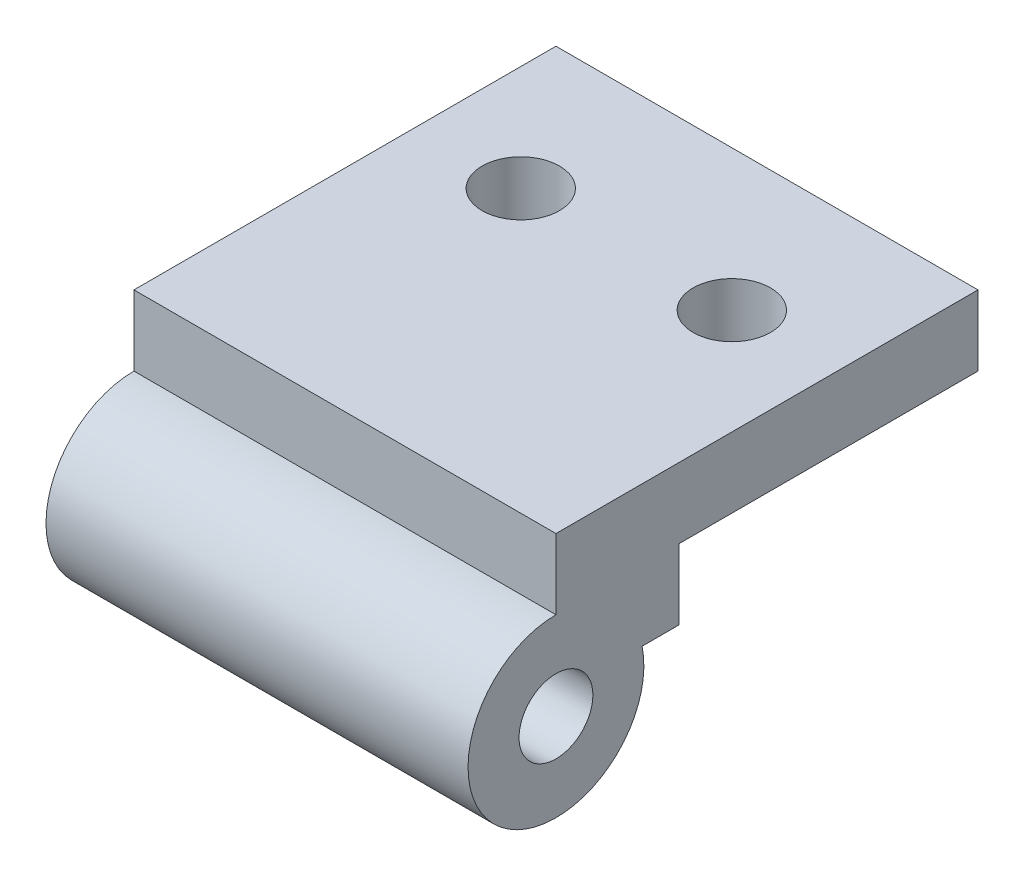
ISO-10303-21;
HEADER;
FILE_DESCRIPTION(('STEP AP214'),'2;1');
FILE_NAME('part.step','',(''),(''),'','','');
FILE_SCHEMA(('AUTOMOTIVE_DESIGN { 1 0 10303 214 1 1 1 1 }'));
ENDSEC;
DATA;
#1=APPLICATION_CONTEXT('core data for automotive mechanical design processes');
#2=APPLICATION_PROTOCOL_DEFINITION('international standard','automotive_design',2000,#1);
#3=PRODUCT_CONTEXT('',#1,'mechanical');
#4=PRODUCT('Part','Part','',(#3));
#5=PRODUCT_RELATED_PRODUCT_CATEGORY('part','',(#4));
#6=PRODUCT_DEFINITION_FORMATION('','',#4);
#7=PRODUCT_DEFINITION_CONTEXT('part definition',#1,'design');
#8=PRODUCT_DEFINITION('design','',#6,#7);
#9=PRODUCT_DEFINITION_SHAPE('','',#8);
#10=(LENGTH_UNIT() NAMED_UNIT(*) SI_UNIT(.MILLI.,.METRE.));
#11=(NAMED_UNIT(*) PLANE_ANGLE_UNIT() SI_UNIT($,.RADIAN.));
#12=(NAMED_UNIT(*) SI_UNIT($,.STERADIAN.) SOLID_ANGLE_UNIT());
#13=UNCERTAINTY_MEASURE_WITH_UNIT(LENGTH_MEASURE(1.E-05),#10,'distance_accuracy_value','');
#14=(GEOMETRIC_REPRESENTATION_CONTEXT(3) GLOBAL_UNCERTAINTY_ASSIGNED_CONTEXT((#13)) GLOBAL_UNIT_ASSIGNED_CONTEXT((#10,
#11,#12)) REPRESENTATION_CONTEXT('',''));
#15=CARTESIAN_POINT('',(0.,0.,0.));
#16=DIRECTION('',(0.,0.,1.));
#17=DIRECTION('',(1.,0.,0.));
#18=AXIS2_PLACEMENT_3D('',#15,#16,#17);
#19=CARTESIAN_POINT('',(0.,0.,0.));
#20=DIRECTION('',(0.,1.,0.));
#21=DIRECTION('',(0.,0.,1.));
#22=AXIS2_PLACEMENT_3D('',#19,#20,#21);
#23=PLANE('',#22);
#24=DIRECTION('',(0.,0.,-1.));
#25=VECTOR('',#24,1.);
#26=CARTESIAN_POINT('',(8.99999999999999,0.,0.));
#27=LINE('',#26,#25);
#28=CARTESIAN_POINT('',(8.99999999999999,0.,-108.949489742783));
#29=VERTEX_POINT('',#28);
#30=CARTESIAN_POINT('',(8.99999999999999,0.,-110.));
#31=VERTEX_POINT('',#30);
#32=EDGE_CURVE('E102',#29,#31,#27,.T.);
#33=ORIENTED_EDGE('',*,*,#32,.F.);
#34=DIRECTION('',(1.,0.,0.));
#35=VECTOR('',#34,1.);
#36=CARTESIAN_POINT('',(-3.00000000000001,0.,-108.949489742783));
#37=LINE('',#36,#35);
#38=CARTESIAN_POINT('',(-3.00000000000001,0.,-108.949489742783));
#39=VERTEX_POINT('',#38);
#40=EDGE_CURVE('E11',#29,#39,#37,.F.);
#41=ORIENTED_EDGE('',*,*,#40,.T.);
#42=DIRECTION('',(0.,0.,-1.));
#43=VECTOR('',#42,1.);
#44=CARTESIAN_POINT('',(-3.00000000000001,0.,-108.949489742783));
#45=LINE('',#44,#43);
#46=CARTESIAN_POINT('',(-3.00000000000001,0.,-110.));
#47=VERTEX_POINT('',#46);
#48=EDGE_CURVE('E146',#39,#47,#45,.T.);
#49=ORIENTED_EDGE('',*,*,#48,.T.);
#50=DIRECTION('',(1.,0.,0.));
#51=VECTOR('',#50,1.);
#52=CARTESIAN_POINT('',(0.,0.,-110.));
#53=LINE('',#52,#51);
#54=EDGE_CURVE('E62',#47,#31,#53,.T.);
#55=ORIENTED_EDGE('',*,*,#54,.T.);
#56=EDGE_LOOP('',(#33,#41,#49,#55));
#57=FACE_BOUND('',#56,.T.);
#58=ADVANCED_FACE('F41',(#57),#23,.F.);
#59=CARTESIAN_POINT('',(0.,2.,-110.));
#60=DIRECTION('',(0.,0.,-1.));
#61=DIRECTION('',(-1.,0.,0.));
#62=AXIS2_PLACEMENT_3D('',#59,#60,#61);
#63=PLANE('',#62);
#64=DIRECTION('',(1.,0.,0.));
#65=VECTOR('',#64,1.);
#66=CARTESIAN_POINT('',(0.,2.,-110.));
#67=LINE('',#66,#65);
#68=CARTESIAN_POINT('',(-3.00000000000001,2.,-110.));
#69=VERTEX_POINT('',#68);
#70=CARTESIAN_POINT('',(8.99999999999999,2.,-110.));
#71=VERTEX_POINT('',#70);
#72=EDGE_CURVE('E47',#69,#71,#67,.T.);
#73=ORIENTED_EDGE('',*,*,#72,.T.);
#74=DIRECTION('',(0.,-1.,0.));
#75=VECTOR('',#74,1.);
#76=CARTESIAN_POINT('',(8.99999999999999,2.,-110.));
#77=LINE('',#76,#75);
#78=EDGE_CURVE('E100',#71,#31,#77,.T.);
#79=ORIENTED_EDGE('',*,*,#78,.T.);
#80=ORIENTED_EDGE('',*,*,#54,.F.);
#81=DIRECTION('',(0.,1.,0.));
#82=VECTOR('',#81,1.);
#83=CARTESIAN_POINT('',(-3.00000000000001,0.,-110.));
#84=LINE('',#83,#82);
#85=EDGE_CURVE('E57',#47,#69,#84,.T.);
#86=ORIENTED_EDGE('',*,*,#85,.T.);
#87=EDGE_LOOP('',(#73,#79,#80,#86));
#88=FACE_BOUND('',#87,.T.);
#89=ADVANCED_FACE('F43',(#88),#63,.T.);
#90=CARTESIAN_POINT('',(-3.00000000000001,-0.5,-106.5));
#91=DIRECTION('',(1.,0.,0.));
#92=DIRECTION('',(0.,0.,-1.));
#93=AXIS2_PLACEMENT_3D('',#90,#91,#92);
#94=CYLINDRICAL_SURFACE('',#93,2.50000000000002);
#95=CARTESIAN_POINT('',(8.99999999999999,-0.5,-106.5));
#96=DIRECTION('',(1.,0.,0.));
#97=DIRECTION('',(0.,0.,-1.));
#98=AXIS2_PLACEMENT_3D('',#95,#96,#97);
#99=CIRCLE('',#98,2.50000000000002);
#100=CARTESIAN_POINT('',(8.99999999999999,2.,-106.5));
#101=VERTEX_POINT('',#100);
#102=EDGE_CURVE('E143',#101,#29,#99,.T.);
#103=ORIENTED_EDGE('',*,*,#102,.F.);
#104=DIRECTION('',(1.,0.,0.));
#105=VECTOR('',#104,1.);
#106=CARTESIAN_POINT('',(-3.00000000000001,2.00000000000003,-106.5));
#107=LINE('',#106,#105);
#108=CARTESIAN_POINT('',(-3.00000000000001,2.,-106.5));
#109=VERTEX_POINT('',#108);
#110=EDGE_CURVE('E153',#109,#101,#107,.T.);
#111=ORIENTED_EDGE('',*,*,#110,.F.);
#112=CARTESIAN_POINT('',(-3.00000000000001,-0.5,-106.5));
#113=DIRECTION('',(1.,0.,0.));
#114=DIRECTION('',(0.,0.,-1.));
#115=AXIS2_PLACEMENT_3D('',#112,#113,#114);
#116=CIRCLE('',#115,2.50000000000002);
#117=EDGE_CURVE('E142',#109,#39,#116,.T.);
#118=ORIENTED_EDGE('',*,*,#117,.T.);
#119=ORIENTED_EDGE('',*,*,#40,.F.);
#120=EDGE_LOOP('',(#103,#111,#118,#119));
#121=FACE_BOUND('',#120,.T.);
#122=ADVANCED_FACE('F176',(#121),#94,.T.);
#123=CARTESIAN_POINT('',(8.99999999999999,-0.5,-106.5));
#124=DIRECTION('',(1.,0.,0.));
#125=DIRECTION('',(0.,0.,-1.));
#126=AXIS2_PLACEMENT_3D('',#123,#124,#125);
#127=PLANE('',#126);
#128=CARTESIAN_POINT('',(8.99999999999999,-0.5,-106.5));
#129=DIRECTION('',(1.,0.,0.));
#130=DIRECTION('',(0.,0.,-1.));
#131=AXIS2_PLACEMENT_3D('',#128,#129,#130);
#132=CIRCLE('',#131,1.05);
#133=CARTESIAN_POINT('',(8.99999999999999,-0.5,-107.55));
#134=VERTEX_POINT('',#133);
#135=EDGE_CURVE('E139',#134,#134,#132,.T.);
#136=ORIENTED_EDGE('',*,*,#135,.F.);
#137=EDGE_LOOP('',(#136));
#138=FACE_BOUND('',#137,.T.);
#139=ORIENTED_EDGE('',*,*,#102,.T.);
#140=ORIENTED_EDGE('',*,*,#32,.T.);
#141=ORIENTED_EDGE('',*,*,#78,.F.);
#142=DIRECTION('',(0.,0.,-1.));
#143=VECTOR('',#142,1.);
#144=CARTESIAN_POINT('',(8.99999999999999,2.,-118.5));
#145=LINE('',#144,#143);
#146=CARTESIAN_POINT('',(8.99999999999999,2.,-118.5));
#147=VERTEX_POINT('',#146);
#148=EDGE_CURVE('E101',#71,#147,#145,.T.);
#149=ORIENTED_EDGE('',*,*,#148,.T.);
#150=DIRECTION('',(0.,-1.,0.));
#151=VECTOR('',#150,1.);
#152=CARTESIAN_POINT('',(8.99999999999999,4.,-118.5));
#153=LINE('',#152,#151);
#154=CARTESIAN_POINT('',(8.99999999999999,4.,-118.5));
#155=VERTEX_POINT('',#154);
#156=EDGE_CURVE('E134',#155,#147,#153,.T.);
#157=ORIENTED_EDGE('',*,*,#156,.F.);
#158=DIRECTION('',(0.,0.,-1.));
#159=VECTOR('',#158,1.);
#160=CARTESIAN_POINT('',(8.99999999999999,4.,-118.5));
#161=LINE('',#160,#159);
#162=CARTESIAN_POINT('',(8.99999999999999,4.,-106.5));
#163=VERTEX_POINT('',#162);
#164=EDGE_CURVE('E166',#163,#155,#161,.T.);
#165=ORIENTED_EDGE('',*,*,#164,.F.);
#166=DIRECTION('',(0.,-1.,0.));
#167=VECTOR('',#166,1.);
#168=CARTESIAN_POINT('',(8.99999999999999,4.,-106.5));
#169=LINE('',#168,#167);
#170=EDGE_CURVE('E133',#163,#101,#169,.T.);
#171=ORIENTED_EDGE('',*,*,#170,.T.);
#172=EDGE_LOOP('',(#139,#140,#141,#149,#157,#165,#171));
#173=FACE_BOUND('',#172,.T.);
#174=ADVANCED_FACE('F97',(#138,#173),#127,.T.);
#175=CARTESIAN_POINT('',(-3.00000000000001,-0.5,-106.5));
#176=DIRECTION('',(1.,0.,0.));
#177=DIRECTION('',(0.,0.,-1.));
#178=AXIS2_PLACEMENT_3D('',#175,#176,#177);
#179=PLANE('',#178);
#180=CARTESIAN_POINT('',(-3.00000000000001,-0.5,-106.5));
#181=DIRECTION('',(1.,0.,0.));
#182=DIRECTION('',(0.,0.,-1.));
#183=AXIS2_PLACEMENT_3D('',#180,#181,#182);
#184=CIRCLE('',#183,1.05);
#185=CARTESIAN_POINT('',(-3.00000000000001,-0.5,-107.55));
#186=VERTEX_POINT('',#185);
#187=EDGE_CURVE('E144',#186,#186,#184,.T.);
#188=ORIENTED_EDGE('',*,*,#187,.T.);
#189=EDGE_LOOP('',(#188));
#190=FACE_BOUND('',#189,.T.);
#191=ORIENTED_EDGE('',*,*,#117,.F.);
#192=DIRECTION('',(0.,-1.,0.));
#193=VECTOR('',#192,1.);
#194=CARTESIAN_POINT('',(-3.00000000000001,4.,-106.5));
#195=LINE('',#194,#193);
#196=CARTESIAN_POINT('',(-3.00000000000001,4.,-106.5));
#197=VERTEX_POINT('',#196);
#198=EDGE_CURVE('E130',#197,#109,#195,.T.);
#199=ORIENTED_EDGE('',*,*,#198,.F.);
#200=DIRECTION('',(0.,0.,1.));
#201=VECTOR('',#200,1.);
#202=CARTESIAN_POINT('',(-3.00000000000001,4.,-106.5));
#203=LINE('',#202,#201);
#204=CARTESIAN_POINT('',(-3.00000000000001,4.,-118.5));
#205=VERTEX_POINT('',#204);
#206=EDGE_CURVE('E125',#205,#197,#203,.T.);
#207=ORIENTED_EDGE('',*,*,#206,.F.);
#208=DIRECTION('',(0.,-1.,0.));
#209=VECTOR('',#208,1.);
#210=CARTESIAN_POINT('',(-3.00000000000001,4.,-118.5));
#211=LINE('',#210,#209);
#212=CARTESIAN_POINT('',(-3.00000000000001,2.,-118.5));
#213=VERTEX_POINT('',#212);
#214=EDGE_CURVE('E129',#205,#213,#211,.T.);
#215=ORIENTED_EDGE('',*,*,#214,.T.);
#216=DIRECTION('',(0.,0.,1.));
#217=VECTOR('',#216,1.);
#218=CARTESIAN_POINT('',(-3.00000000000001,2.,-106.5));
#219=LINE('',#218,#217);
#220=EDGE_CURVE('E116',#213,#69,#219,.T.);
#221=ORIENTED_EDGE('',*,*,#220,.T.);
#222=ORIENTED_EDGE('',*,*,#85,.F.);
#223=ORIENTED_EDGE('',*,*,#48,.F.);
#224=EDGE_LOOP('',(#191,#199,#207,#215,#221,#222,#223));
#225=FACE_BOUND('',#224,.T.);
#226=ADVANCED_FACE('F156',(#190,#225),#179,.F.);
#227=CARTESIAN_POINT('',(8.99999999999999,-0.5,-106.5));
#228=DIRECTION('',(1.,0.,0.));
#229=DIRECTION('',(0.,0.,-1.));
#230=AXIS2_PLACEMENT_3D('',#227,#228,#229);
#231=CYLINDRICAL_SURFACE('',#230,1.05);
#232=ORIENTED_EDGE('',*,*,#135,.T.);
#233=EDGE_LOOP('',(#232));
#234=FACE_BOUND('',#233,.T.);
#235=ORIENTED_EDGE('',*,*,#187,.F.);
#236=EDGE_LOOP('',(#235));
#237=FACE_BOUND('',#236,.T.);
#238=ADVANCED_FACE('F262',(#234,#237),#231,.F.);
#239=CARTESIAN_POINT('',(-3.00000000000001,4.,-106.5));
#240=DIRECTION('',(0.,0.,-1.));
#241=DIRECTION('',(-1.,0.,0.));
#242=AXIS2_PLACEMENT_3D('',#239,#240,#241);
#243=PLANE('',#242);
#244=ORIENTED_EDGE('',*,*,#110,.T.);
#245=ORIENTED_EDGE('',*,*,#170,.F.);
#246=DIRECTION('',(1.,0.,0.));
#247=VECTOR('',#246,1.);
#248=CARTESIAN_POINT('',(-3.00000000000001,4.,-106.5));
#249=LINE('',#248,#247);
#250=EDGE_CURVE('E126',#197,#163,#249,.T.);
#251=ORIENTED_EDGE('',*,*,#250,.F.);
#252=ORIENTED_EDGE('',*,*,#198,.T.);
#253=EDGE_LOOP('',(#244,#245,#251,#252));
#254=FACE_BOUND('',#253,.T.);
#255=ADVANCED_FACE('F178',(#254),#243,.F.);
#256=CARTESIAN_POINT('',(-3.00000000000001,4.,-118.5));
#257=DIRECTION('',(0.,0.,1.));
#258=DIRECTION('',(1.,0.,0.));
#259=AXIS2_PLACEMENT_3D('',#256,#257,#258);
#260=PLANE('',#259);
#261=DIRECTION('',(-1.,0.,0.));
#262=VECTOR('',#261,1.);
#263=CARTESIAN_POINT('',(-3.00000000000001,2.,-118.5));
#264=LINE('',#263,#262);
#265=EDGE_CURVE('E111',#147,#213,#264,.T.);
#266=ORIENTED_EDGE('',*,*,#265,.T.);
#267=ORIENTED_EDGE('',*,*,#214,.F.);
#268=DIRECTION('',(-1.,0.,0.));
#269=VECTOR('',#268,1.);
#270=CARTESIAN_POINT('',(-3.00000000000001,4.,-118.5));
#271=LINE('',#270,#269);
#272=EDGE_CURVE('E169',#155,#205,#271,.T.);
#273=ORIENTED_EDGE('',*,*,#272,.F.);
#274=ORIENTED_EDGE('',*,*,#156,.T.);
#275=EDGE_LOOP('',(#266,#267,#273,#274));
#276=FACE_BOUND('',#275,.T.);
#277=ADVANCED_FACE('F163',(#276),#260,.F.);
#278=CARTESIAN_POINT('',(0.,4.,0.));
#279=DIRECTION('',(0.,-1.,0.));
#280=DIRECTION('',(0.,0.,-1.));
#281=AXIS2_PLACEMENT_3D('',#278,#279,#280);
#282=PLANE('',#281);
#283=CARTESIAN_POINT('',(6.00000000000005,4.,-114.5));
#284=DIRECTION('',(0.,-1.,0.));
#285=DIRECTION('',(0.,0.,-1.));
#286=AXIS2_PLACEMENT_3D('',#283,#284,#285);
#287=CIRCLE('',#286,1.10000000000001);
#288=CARTESIAN_POINT('',(6.00000000000005,4.,-115.6));
#289=VERTEX_POINT('',#288);
#290=EDGE_CURVE('E114',#289,#289,#287,.T.);
#291=ORIENTED_EDGE('',*,*,#290,.T.);
#292=EDGE_LOOP('',(#291));
#293=FACE_BOUND('',#292,.T.);
#294=CARTESIAN_POINT('',(0.,4.,-114.5));
#295=DIRECTION('',(0.,-1.,0.));
#296=DIRECTION('',(0.,0.,1.));
#297=AXIS2_PLACEMENT_3D('',#294,#295,#296);
#298=CIRCLE('',#297,1.10000000000001);
#299=CARTESIAN_POINT('',(0.,4.,-113.4));
#300=VERTEX_POINT('',#299);
#301=EDGE_CURVE('E298',#300,#300,#298,.T.);
#302=ORIENTED_EDGE('',*,*,#301,.T.);
#303=EDGE_LOOP('',(#302));
#304=FACE_BOUND('',#303,.T.);
#305=ORIENTED_EDGE('',*,*,#206,.T.);
#306=ORIENTED_EDGE('',*,*,#250,.T.);
#307=ORIENTED_EDGE('',*,*,#164,.T.);
#308=ORIENTED_EDGE('',*,*,#272,.T.);
#309=EDGE_LOOP('',(#305,#306,#307,#308));
#310=FACE_BOUND('',#309,.T.);
#311=ADVANCED_FACE('F175',(#293,#304,#310),#282,.F.);
#312=CARTESIAN_POINT('',(0.,2.,0.));
#313=DIRECTION('',(0.,-1.,0.));
#314=DIRECTION('',(0.,0.,-1.));
#315=AXIS2_PLACEMENT_3D('',#312,#313,#314);
#316=PLANE('',#315);
#317=CARTESIAN_POINT('',(6.00000000000005,2.,-114.5));
#318=DIRECTION('',(0.,-1.,0.));
#319=DIRECTION('',(0.,0.,-1.));
#320=AXIS2_PLACEMENT_3D('',#317,#318,#319);
#321=CIRCLE('',#320,1.10000000000001);
#322=CARTESIAN_POINT('',(6.00000000000005,2.,-115.6));
#323=VERTEX_POINT('',#322);
#324=EDGE_CURVE('E117',#323,#323,#321,.T.);
#325=ORIENTED_EDGE('',*,*,#324,.F.);
#326=EDGE_LOOP('',(#325));
#327=FACE_BOUND('',#326,.T.);
#328=CARTESIAN_POINT('',(0.,2.,-114.5));
#329=DIRECTION('',(0.,-1.,0.));
#330=DIRECTION('',(0.,0.,1.));
#331=AXIS2_PLACEMENT_3D('',#328,#329,#330);
#332=CIRCLE('',#331,1.10000000000001);
#333=CARTESIAN_POINT('',(0.,2.,-113.4));
#334=VERTEX_POINT('',#333);
#335=EDGE_CURVE('E297',#334,#334,#332,.T.);
#336=ORIENTED_EDGE('',*,*,#335,.F.);
#337=EDGE_LOOP('',(#336));
#338=FACE_BOUND('',#337,.T.);
#339=ORIENTED_EDGE('',*,*,#148,.F.);
#340=ORIENTED_EDGE('',*,*,#72,.F.);
#341=ORIENTED_EDGE('',*,*,#220,.F.);
#342=ORIENTED_EDGE('',*,*,#265,.F.);
#343=EDGE_LOOP('',(#339,#340,#341,#342));
#344=FACE_BOUND('',#343,.T.);
#345=ADVANCED_FACE('F115',(#327,#338,#344),#316,.T.);
#346=CARTESIAN_POINT('',(0.,4.,-114.5));
#347=DIRECTION('',(0.,-1.,0.));
#348=DIRECTION('',(0.,0.,-1.));
#349=AXIS2_PLACEMENT_3D('',#346,#347,#348);
#350=CYLINDRICAL_SURFACE('',#349,1.10000000000001);
#351=ORIENTED_EDGE('',*,*,#301,.F.);
#352=EDGE_LOOP('',(#351));
#353=FACE_BOUND('',#352,.T.);
#354=ORIENTED_EDGE('',*,*,#335,.T.);
#355=EDGE_LOOP('',(#354));
#356=FACE_BOUND('',#355,.T.);
#357=ADVANCED_FACE('F231',(#353,#356),#350,.F.);
#358=CARTESIAN_POINT('',(6.00000000000005,4.,-114.5));
#359=DIRECTION('',(0.,-1.,0.));
#360=DIRECTION('',(0.,0.,-1.));
#361=AXIS2_PLACEMENT_3D('',#358,#359,#360);
#362=CYLINDRICAL_SURFACE('',#361,1.10000000000001);
#363=ORIENTED_EDGE('',*,*,#290,.F.);
#364=EDGE_LOOP('',(#363));
#365=FACE_BOUND('',#364,.T.);
#366=ORIENTED_EDGE('',*,*,#324,.T.);
#367=EDGE_LOOP('',(#366));
#368=FACE_BOUND('',#367,.T.);
#369=ADVANCED_FACE('F226',(#365,#368),#362,.F.);
#370=CLOSED_SHELL('',(#58,#89,#122,#174,#226,#238,#255,#277,#311,#345,#357,#369));
#371=MANIFOLD_SOLID_BREP('B2',#370);
#372=ADVANCED_BREP_SHAPE_REPRESENTATION('',(#18,#371),#14);
#373=SHAPE_DEFINITION_REPRESENTATION(#9,#372);
ENDSEC;
END-ISO-10303-21;
